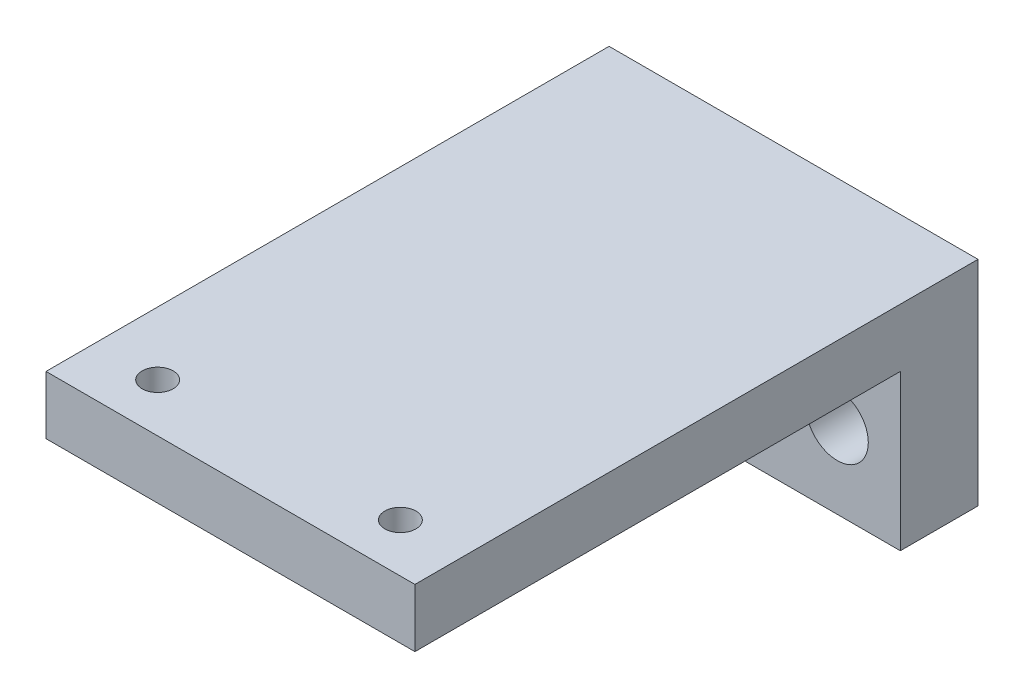
ISO-10303-21;
HEADER;
FILE_DESCRIPTION(('STEP AP214'),'2;1');
FILE_NAME('part.step','',(''),(''),'','','');
FILE_SCHEMA(('AUTOMOTIVE_DESIGN { 1 0 10303 214 1 1 1 1 }'));
ENDSEC;
DATA;
#1=APPLICATION_CONTEXT('core data for automotive mechanical design processes');
#2=APPLICATION_PROTOCOL_DEFINITION('international standard','automotive_design',2000,#1);
#3=PRODUCT_CONTEXT('',#1,'mechanical');
#4=PRODUCT('Part','Part','',(#3));
#5=PRODUCT_RELATED_PRODUCT_CATEGORY('part','',(#4));
#6=PRODUCT_DEFINITION_FORMATION('','',#4);
#7=PRODUCT_DEFINITION_CONTEXT('part definition',#1,'design');
#8=PRODUCT_DEFINITION('design','',#6,#7);
#9=PRODUCT_DEFINITION_SHAPE('','',#8);
#10=(LENGTH_UNIT() NAMED_UNIT(*) SI_UNIT(.MILLI.,.METRE.));
#11=(NAMED_UNIT(*) PLANE_ANGLE_UNIT() SI_UNIT($,.RADIAN.));
#12=(NAMED_UNIT(*) SI_UNIT($,.STERADIAN.) SOLID_ANGLE_UNIT());
#13=UNCERTAINTY_MEASURE_WITH_UNIT(LENGTH_MEASURE(1.E-05),#10,'distance_accuracy_value','');
#14=(GEOMETRIC_REPRESENTATION_CONTEXT(3) GLOBAL_UNCERTAINTY_ASSIGNED_CONTEXT((#13)) GLOBAL_UNIT_ASSIGNED_CONTEXT((#10,
#11,#12)) REPRESENTATION_CONTEXT('',''));
#15=CARTESIAN_POINT('',(0.,0.,0.));
#16=DIRECTION('',(0.,0.,1.));
#17=DIRECTION('',(1.,0.,0.));
#18=AXIS2_PLACEMENT_3D('',#15,#16,#17);
#19=CARTESIAN_POINT('',(-19.3199402491737,32.4818332062039,8.));
#20=DIRECTION('',(1.,0.,0.));
#21=DIRECTION('',(0.,1.,0.));
#22=AXIS2_PLACEMENT_3D('',#19,#20,#21);
#23=PLANE('',#22);
#24=DIRECTION('',(0.,-1.,0.));
#25=VECTOR('',#24,1.);
#26=CARTESIAN_POINT('',(-19.3199402491737,32.4818332062039,0.));
#27=LINE('',#26,#25);
#28=CARTESIAN_POINT('',(-19.3199402491737,32.4818332062039,0.));
#29=VERTEX_POINT('',#28);
#30=CARTESIAN_POINT('',(-19.3199402491737,10.4818332062039,0.));
#31=VERTEX_POINT('',#30);
#32=EDGE_CURVE('E132',#29,#31,#27,.T.);
#33=ORIENTED_EDGE('',*,*,#32,.T.);
#34=DIRECTION('',(0.,0.,1.));
#35=VECTOR('',#34,1.);
#36=CARTESIAN_POINT('',(-19.3199402491737,10.4818332062039,-2.));
#37=LINE('',#36,#35);
#38=CARTESIAN_POINT('',(-19.3199402491737,10.4818332062039,8.));
#39=VERTEX_POINT('',#38);
#40=EDGE_CURVE('E46',#31,#39,#37,.T.);
#41=ORIENTED_EDGE('',*,*,#40,.T.);
#42=DIRECTION('',(0.,-1.,0.));
#43=VECTOR('',#42,1.);
#44=CARTESIAN_POINT('',(-19.3199402491737,32.4818332062039,8.));
#45=LINE('',#44,#43);
#46=CARTESIAN_POINT('',(-19.3199402491737,26.4818332062039,8.));
#47=VERTEX_POINT('',#46);
#48=EDGE_CURVE('E92',#47,#39,#45,.T.);
#49=ORIENTED_EDGE('',*,*,#48,.F.);
#50=DIRECTION('',(0.,0.,-1.));
#51=VECTOR('',#50,1.);
#52=CARTESIAN_POINT('',(-19.3199402491737,26.4818332062039,58.));
#53=LINE('',#52,#51);
#54=CARTESIAN_POINT('',(-19.3199402491737,26.4818332062039,58.));
#55=VERTEX_POINT('',#54);
#56=EDGE_CURVE('E136',#55,#47,#53,.T.);
#57=ORIENTED_EDGE('',*,*,#56,.F.);
#58=DIRECTION('',(0.,-1.,0.));
#59=VECTOR('',#58,1.);
#60=CARTESIAN_POINT('',(-19.3199402491737,32.4818332062039,58.));
#61=LINE('',#60,#59);
#62=CARTESIAN_POINT('',(-19.3199402491737,32.4818332062039,58.));
#63=VERTEX_POINT('',#62);
#64=EDGE_CURVE('E117',#63,#55,#61,.T.);
#65=ORIENTED_EDGE('',*,*,#64,.F.);
#66=DIRECTION('',(0.,0.,-1.));
#67=VECTOR('',#66,1.);
#68=CARTESIAN_POINT('',(-19.3199402491737,32.4818332062039,8.));
#69=LINE('',#68,#67);
#70=EDGE_CURVE('E100',#63,#29,#69,.T.);
#71=ORIENTED_EDGE('',*,*,#70,.T.);
#72=EDGE_LOOP('',(#33,#41,#49,#57,#65,#71));
#73=FACE_BOUND('',#72,.T.);
#74=ADVANCED_FACE('F30',(#73),#23,.F.);
#75=CARTESIAN_POINT('',(18.6800597508263,32.4818332062039,8.));
#76=DIRECTION('',(-1.,0.,0.));
#77=DIRECTION('',(0.,-1.,0.));
#78=AXIS2_PLACEMENT_3D('',#75,#76,#77);
#79=PLANE('',#78);
#80=DIRECTION('',(0.,1.,0.));
#81=VECTOR('',#80,1.);
#82=CARTESIAN_POINT('',(18.6800597508263,32.4818332062039,8.));
#83=LINE('',#82,#81);
#84=CARTESIAN_POINT('',(18.6800597508263,10.4818332062039,8.));
#85=VERTEX_POINT('',#84);
#86=CARTESIAN_POINT('',(18.6800597508263,26.4818332062039,8.));
#87=VERTEX_POINT('',#86);
#88=EDGE_CURVE('E91',#85,#87,#83,.T.);
#89=ORIENTED_EDGE('',*,*,#88,.F.);
#90=DIRECTION('',(0.,0.,1.));
#91=VECTOR('',#90,1.);
#92=CARTESIAN_POINT('',(18.6800597508263,10.4818332062039,-2.));
#93=LINE('',#92,#91);
#94=CARTESIAN_POINT('',(18.6800597508263,10.4818332062039,0.));
#95=VERTEX_POINT('',#94);
#96=EDGE_CURVE('E82',#95,#85,#93,.T.);
#97=ORIENTED_EDGE('',*,*,#96,.F.);
#98=DIRECTION('',(0.,1.,0.));
#99=VECTOR('',#98,1.);
#100=CARTESIAN_POINT('',(18.6800597508263,32.4818332062039,0.));
#101=LINE('',#100,#99);
#102=CARTESIAN_POINT('',(18.6800597508263,32.4818332062039,0.));
#103=VERTEX_POINT('',#102);
#104=EDGE_CURVE('E135',#95,#103,#101,.T.);
#105=ORIENTED_EDGE('',*,*,#104,.T.);
#106=DIRECTION('',(0.,0.,-1.));
#107=VECTOR('',#106,1.);
#108=CARTESIAN_POINT('',(18.6800597508263,32.4818332062039,8.));
#109=LINE('',#108,#107);
#110=CARTESIAN_POINT('',(18.6800597508263,32.4818332062039,58.));
#111=VERTEX_POINT('',#110);
#112=EDGE_CURVE('E38',#111,#103,#109,.T.);
#113=ORIENTED_EDGE('',*,*,#112,.F.);
#114=DIRECTION('',(0.,1.,0.));
#115=VECTOR('',#114,1.);
#116=CARTESIAN_POINT('',(18.6800597508263,32.4818332062039,58.));
#117=LINE('',#116,#115);
#118=CARTESIAN_POINT('',(18.6800597508263,26.4818332062039,58.));
#119=VERTEX_POINT('',#118);
#120=EDGE_CURVE('E126',#119,#111,#117,.T.);
#121=ORIENTED_EDGE('',*,*,#120,.F.);
#122=DIRECTION('',(0.,0.,-1.));
#123=VECTOR('',#122,1.);
#124=CARTESIAN_POINT('',(18.6800597508263,26.4818332062039,58.));
#125=LINE('',#124,#123);
#126=EDGE_CURVE('E99',#119,#87,#125,.T.);
#127=ORIENTED_EDGE('',*,*,#126,.T.);
#128=EDGE_LOOP('',(#89,#97,#105,#113,#121,#127));
#129=FACE_BOUND('',#128,.T.);
#130=ADVANCED_FACE('F96',(#129),#79,.F.);
#131=CARTESIAN_POINT('',(-19.3199402491737,32.4818332062039,8.));
#132=DIRECTION('',(0.,-1.,0.));
#133=DIRECTION('',(0.,0.,-1.));
#134=AXIS2_PLACEMENT_3D('',#131,#132,#133);
#135=PLANE('',#134);
#136=CARTESIAN_POINT('',(-12.8199402491737,32.4818332062039,53.));
#137=DIRECTION('',(0.,-1.,0.));
#138=DIRECTION('',(0.,0.,-1.));
#139=AXIS2_PLACEMENT_3D('',#136,#137,#138);
#140=CIRCLE('',#139,1.6);
#141=CARTESIAN_POINT('',(-12.8199402491737,32.4818332062039,51.4));
#142=VERTEX_POINT('',#141);
#143=EDGE_CURVE('E168',#142,#142,#140,.T.);
#144=ORIENTED_EDGE('',*,*,#143,.T.);
#145=EDGE_LOOP('',(#144));
#146=FACE_BOUND('',#145,.T.);
#147=CARTESIAN_POINT('',(12.1800597508263,32.4818332062039,53.));
#148=DIRECTION('',(0.,-1.,0.));
#149=DIRECTION('',(0.,0.,-1.));
#150=AXIS2_PLACEMENT_3D('',#147,#148,#149);
#151=CIRCLE('',#150,1.6);
#152=CARTESIAN_POINT('',(12.1800597508263,32.4818332062039,51.4));
#153=VERTEX_POINT('',#152);
#154=EDGE_CURVE('E162',#153,#153,#151,.T.);
#155=ORIENTED_EDGE('',*,*,#154,.T.);
#156=EDGE_LOOP('',(#155));
#157=FACE_BOUND('',#156,.T.);
#158=DIRECTION('',(-1.,0.,0.));
#159=VECTOR('',#158,1.);
#160=CARTESIAN_POINT('',(-19.3199402491737,32.4818332062039,0.));
#161=LINE('',#160,#159);
#162=EDGE_CURVE('E104',#103,#29,#161,.T.);
#163=ORIENTED_EDGE('',*,*,#162,.T.);
#164=ORIENTED_EDGE('',*,*,#70,.F.);
#165=DIRECTION('',(-1.,0.,0.));
#166=VECTOR('',#165,1.);
#167=CARTESIAN_POINT('',(-19.3199402491737,32.4818332062039,58.));
#168=LINE('',#167,#166);
#169=EDGE_CURVE('E129',#111,#63,#168,.T.);
#170=ORIENTED_EDGE('',*,*,#169,.F.);
#171=ORIENTED_EDGE('',*,*,#112,.T.);
#172=EDGE_LOOP('',(#163,#164,#170,#171));
#173=FACE_BOUND('',#172,.T.);
#174=ADVANCED_FACE('F139',(#146,#157,#173),#135,.F.);
#175=CARTESIAN_POINT('',(-19.3199402491737,-5.51816679379607,8.));
#176=DIRECTION('',(0.,0.,1.));
#177=DIRECTION('',(1.,0.,0.));
#178=AXIS2_PLACEMENT_3D('',#175,#176,#177);
#179=PLANE('',#178);
#180=CARTESIAN_POINT('',(12.1800597508263,18.4818332062039,8.));
#181=DIRECTION('',(0.,0.,1.));
#182=DIRECTION('',(1.,0.,0.));
#183=AXIS2_PLACEMENT_3D('',#180,#181,#182);
#184=CIRCLE('',#183,3.2);
#185=CARTESIAN_POINT('',(15.3800597508263,18.4818332062039,8.));
#186=VERTEX_POINT('',#185);
#187=EDGE_CURVE('E159',#186,#186,#184,.T.);
#188=ORIENTED_EDGE('',*,*,#187,.F.);
#189=EDGE_LOOP('',(#188));
#190=FACE_BOUND('',#189,.T.);
#191=CARTESIAN_POINT('',(-12.8199402491737,18.4818332062039,8.));
#192=DIRECTION('',(0.,0.,1.));
#193=DIRECTION('',(1.,0.,0.));
#194=AXIS2_PLACEMENT_3D('',#191,#192,#193);
#195=CIRCLE('',#194,3.2);
#196=CARTESIAN_POINT('',(-9.61994024917366,18.4818332062039,8.));
#197=VERTEX_POINT('',#196);
#198=EDGE_CURVE('E156',#197,#197,#195,.T.);
#199=ORIENTED_EDGE('',*,*,#198,.F.);
#200=EDGE_LOOP('',(#199));
#201=FACE_BOUND('',#200,.T.);
#202=DIRECTION('',(-1.,0.,0.));
#203=VECTOR('',#202,1.);
#204=CARTESIAN_POINT('',(-19.3199402491737,10.4818332062039,8.));
#205=LINE('',#204,#203);
#206=EDGE_CURVE('E85',#85,#39,#205,.T.);
#207=ORIENTED_EDGE('',*,*,#206,.F.);
#208=ORIENTED_EDGE('',*,*,#88,.T.);
#209=DIRECTION('',(1.,0.,0.));
#210=VECTOR('',#209,1.);
#211=CARTESIAN_POINT('',(-19.3199402491737,26.4818332062039,8.));
#212=LINE('',#211,#210);
#213=EDGE_CURVE('E53',#47,#87,#212,.T.);
#214=ORIENTED_EDGE('',*,*,#213,.F.);
#215=ORIENTED_EDGE('',*,*,#48,.T.);
#216=EDGE_LOOP('',(#207,#208,#214,#215));
#217=FACE_BOUND('',#216,.T.);
#218=ADVANCED_FACE('F90',(#190,#201,#217),#179,.T.);
#219=CARTESIAN_POINT('',(-19.3199402491737,-5.51816679379607,0.));
#220=DIRECTION('',(0.,0.,1.));
#221=DIRECTION('',(1.,0.,0.));
#222=AXIS2_PLACEMENT_3D('',#219,#220,#221);
#223=PLANE('',#222);
#224=CARTESIAN_POINT('',(12.1800597508263,18.4818332062039,0.));
#225=DIRECTION('',(0.,0.,1.));
#226=DIRECTION('',(1.,0.,0.));
#227=AXIS2_PLACEMENT_3D('',#224,#225,#226);
#228=CIRCLE('',#227,3.2);
#229=CARTESIAN_POINT('',(15.3800597508263,18.4818332062039,0.));
#230=VERTEX_POINT('',#229);
#231=EDGE_CURVE('E33',#230,#230,#228,.T.);
#232=ORIENTED_EDGE('',*,*,#231,.T.);
#233=EDGE_LOOP('',(#232));
#234=FACE_BOUND('',#233,.T.);
#235=CARTESIAN_POINT('',(-12.8199402491737,18.4818332062039,0.));
#236=DIRECTION('',(0.,0.,1.));
#237=DIRECTION('',(1.,0.,0.));
#238=AXIS2_PLACEMENT_3D('',#235,#236,#237);
#239=CIRCLE('',#238,3.2);
#240=CARTESIAN_POINT('',(-9.61994024917366,18.4818332062039,0.));
#241=VERTEX_POINT('',#240);
#242=EDGE_CURVE('E93',#241,#241,#239,.T.);
#243=ORIENTED_EDGE('',*,*,#242,.T.);
#244=EDGE_LOOP('',(#243));
#245=FACE_BOUND('',#244,.T.);
#246=ORIENTED_EDGE('',*,*,#104,.F.);
#247=DIRECTION('',(-1.,0.,0.));
#248=VECTOR('',#247,1.);
#249=CARTESIAN_POINT('',(-19.3199402491737,10.4818332062039,0.));
#250=LINE('',#249,#248);
#251=EDGE_CURVE('E11',#95,#31,#250,.T.);
#252=ORIENTED_EDGE('',*,*,#251,.T.);
#253=ORIENTED_EDGE('',*,*,#32,.F.);
#254=ORIENTED_EDGE('',*,*,#162,.F.);
#255=EDGE_LOOP('',(#246,#252,#253,#254));
#256=FACE_BOUND('',#255,.T.);
#257=ADVANCED_FACE('F146',(#234,#245,#256),#223,.F.);
#258=CARTESIAN_POINT('',(-19.3199402491737,26.4818332062039,58.));
#259=DIRECTION('',(0.,1.,0.));
#260=DIRECTION('',(0.,0.,1.));
#261=AXIS2_PLACEMENT_3D('',#258,#259,#260);
#262=PLANE('',#261);
#263=CARTESIAN_POINT('',(-12.8199402491737,26.4818332062039,53.));
#264=DIRECTION('',(0.,-1.,0.));
#265=DIRECTION('',(0.,0.,-1.));
#266=AXIS2_PLACEMENT_3D('',#263,#264,#265);
#267=CIRCLE('',#266,1.6);
#268=CARTESIAN_POINT('',(-12.8199402491737,26.4818332062039,51.4));
#269=VERTEX_POINT('',#268);
#270=EDGE_CURVE('E171',#269,#269,#267,.T.);
#271=ORIENTED_EDGE('',*,*,#270,.F.);
#272=EDGE_LOOP('',(#271));
#273=FACE_BOUND('',#272,.T.);
#274=CARTESIAN_POINT('',(12.1800597508263,26.4818332062039,53.));
#275=DIRECTION('',(0.,-1.,0.));
#276=DIRECTION('',(0.,0.,-1.));
#277=AXIS2_PLACEMENT_3D('',#274,#275,#276);
#278=CIRCLE('',#277,1.6);
#279=CARTESIAN_POINT('',(12.1800597508263,26.4818332062039,51.4));
#280=VERTEX_POINT('',#279);
#281=EDGE_CURVE('E165',#280,#280,#278,.T.);
#282=ORIENTED_EDGE('',*,*,#281,.F.);
#283=EDGE_LOOP('',(#282));
#284=FACE_BOUND('',#283,.T.);
#285=ORIENTED_EDGE('',*,*,#213,.T.);
#286=ORIENTED_EDGE('',*,*,#126,.F.);
#287=DIRECTION('',(1.,0.,0.));
#288=VECTOR('',#287,1.);
#289=CARTESIAN_POINT('',(-19.3199402491737,26.4818332062039,58.));
#290=LINE('',#289,#288);
#291=EDGE_CURVE('E124',#55,#119,#290,.T.);
#292=ORIENTED_EDGE('',*,*,#291,.F.);
#293=ORIENTED_EDGE('',*,*,#56,.T.);
#294=EDGE_LOOP('',(#285,#286,#292,#293));
#295=FACE_BOUND('',#294,.T.);
#296=ADVANCED_FACE('F151',(#273,#284,#295),#262,.F.);
#297=CARTESIAN_POINT('',(-19.3199402491737,26.4818332062039,58.));
#298=DIRECTION('',(0.,0.,1.));
#299=DIRECTION('',(1.,0.,0.));
#300=AXIS2_PLACEMENT_3D('',#297,#298,#299);
#301=PLANE('',#300);
#302=ORIENTED_EDGE('',*,*,#64,.T.);
#303=ORIENTED_EDGE('',*,*,#291,.T.);
#304=ORIENTED_EDGE('',*,*,#120,.T.);
#305=ORIENTED_EDGE('',*,*,#169,.T.);
#306=EDGE_LOOP('',(#302,#303,#304,#305));
#307=FACE_BOUND('',#306,.T.);
#308=ADVANCED_FACE('F148',(#307),#301,.T.);
#309=CARTESIAN_POINT('',(-19.3199402491737,10.4818332062039,-2.));
#310=DIRECTION('',(0.,1.,0.));
#311=DIRECTION('',(0.,0.,1.));
#312=AXIS2_PLACEMENT_3D('',#309,#310,#311);
#313=PLANE('',#312);
#314=ORIENTED_EDGE('',*,*,#96,.T.);
#315=ORIENTED_EDGE('',*,*,#206,.T.);
#316=ORIENTED_EDGE('',*,*,#40,.F.);
#317=ORIENTED_EDGE('',*,*,#251,.F.);
#318=EDGE_LOOP('',(#314,#315,#316,#317));
#319=FACE_BOUND('',#318,.T.);
#320=ADVANCED_FACE('F84',(#319),#313,.F.);
#321=CARTESIAN_POINT('',(-12.8199402491737,18.4818332062039,-2.));
#322=DIRECTION('',(0.,0.,1.));
#323=DIRECTION('',(1.,0.,0.));
#324=AXIS2_PLACEMENT_3D('',#321,#322,#323);
#325=CYLINDRICAL_SURFACE('',#324,3.2);
#326=ORIENTED_EDGE('',*,*,#198,.T.);
#327=EDGE_LOOP('',(#326));
#328=FACE_BOUND('',#327,.T.);
#329=ORIENTED_EDGE('',*,*,#242,.F.);
#330=EDGE_LOOP('',(#329));
#331=FACE_BOUND('',#330,.T.);
#332=ADVANCED_FACE('F218',(#328,#331),#325,.F.);
#333=CARTESIAN_POINT('',(12.1800597508263,18.4818332062039,-2.));
#334=DIRECTION('',(0.,0.,1.));
#335=DIRECTION('',(1.,0.,0.));
#336=AXIS2_PLACEMENT_3D('',#333,#334,#335);
#337=CYLINDRICAL_SURFACE('',#336,3.2);
#338=ORIENTED_EDGE('',*,*,#187,.T.);
#339=EDGE_LOOP('',(#338));
#340=FACE_BOUND('',#339,.T.);
#341=ORIENTED_EDGE('',*,*,#231,.F.);
#342=EDGE_LOOP('',(#341));
#343=FACE_BOUND('',#342,.T.);
#344=ADVANCED_FACE('F186',(#340,#343),#337,.F.);
#345=CARTESIAN_POINT('',(12.1800597508263,36.4818332062039,53.));
#346=DIRECTION('',(0.,-1.,0.));
#347=DIRECTION('',(0.,0.,-1.));
#348=AXIS2_PLACEMENT_3D('',#345,#346,#347);
#349=CYLINDRICAL_SURFACE('',#348,1.6);
#350=ORIENTED_EDGE('',*,*,#281,.T.);
#351=EDGE_LOOP('',(#350));
#352=FACE_BOUND('',#351,.T.);
#353=ORIENTED_EDGE('',*,*,#154,.F.);
#354=EDGE_LOOP('',(#353));
#355=FACE_BOUND('',#354,.T.);
#356=ADVANCED_FACE('F183',(#352,#355),#349,.F.);
#357=CARTESIAN_POINT('',(-12.8199402491737,36.4818332062039,53.));
#358=DIRECTION('',(0.,-1.,0.));
#359=DIRECTION('',(0.,0.,-1.));
#360=AXIS2_PLACEMENT_3D('',#357,#358,#359);
#361=CYLINDRICAL_SURFACE('',#360,1.6);
#362=ORIENTED_EDGE('',*,*,#270,.T.);
#363=EDGE_LOOP('',(#362));
#364=FACE_BOUND('',#363,.T.);
#365=ORIENTED_EDGE('',*,*,#143,.F.);
#366=EDGE_LOOP('',(#365));
#367=FACE_BOUND('',#366,.T.);
#368=ADVANCED_FACE('F175',(#364,#367),#361,.F.);
#369=CLOSED_SHELL('',(#74,#130,#174,#218,#257,#296,#308,#320,#332,#344,#356,#368));
#370=MANIFOLD_SOLID_BREP('B2',#369);
#371=ADVANCED_BREP_SHAPE_REPRESENTATION('',(#18,#370),#14);
#372=SHAPE_DEFINITION_REPRESENTATION(#9,#371);
ENDSEC;
END-ISO-10303-21;
